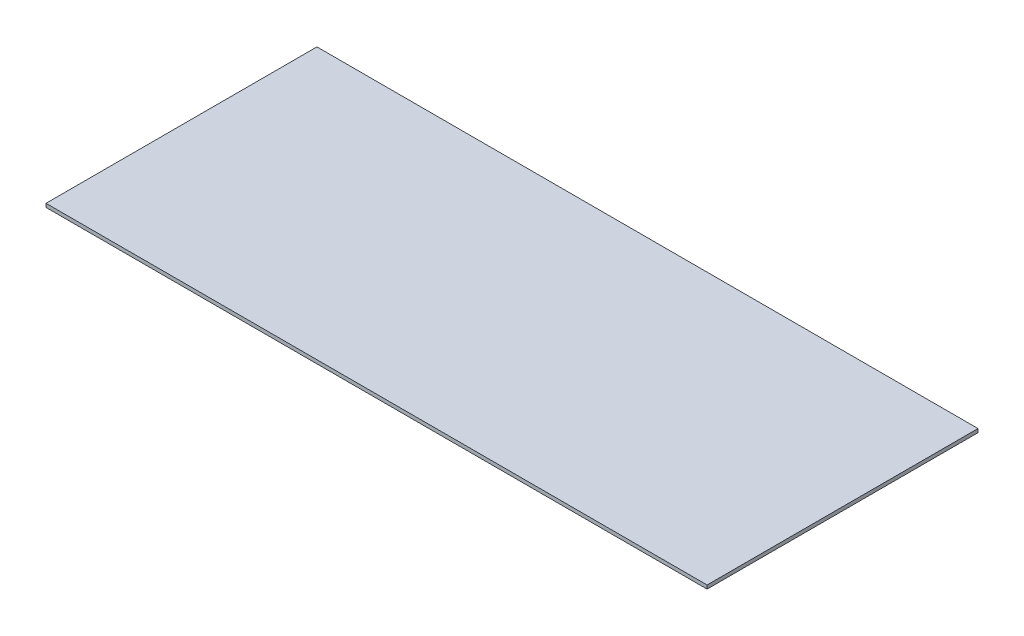
ISO-10303-21;
HEADER;
FILE_DESCRIPTION(('STEP AP214'),'2;1');
FILE_NAME('part.step','',(''),(''),'','','');
FILE_SCHEMA(('AUTOMOTIVE_DESIGN { 1 0 10303 214 1 1 1 1 }'));
ENDSEC;
DATA;
#1=APPLICATION_CONTEXT('core data for automotive mechanical design processes');
#2=APPLICATION_PROTOCOL_DEFINITION('international standard','automotive_design',2000,#1);
#3=PRODUCT_CONTEXT('',#1,'mechanical');
#4=PRODUCT('Part','Part','',(#3));
#5=PRODUCT_RELATED_PRODUCT_CATEGORY('part','',(#4));
#6=PRODUCT_DEFINITION_FORMATION('','',#4);
#7=PRODUCT_DEFINITION_CONTEXT('part definition',#1,'design');
#8=PRODUCT_DEFINITION('design','',#6,#7);
#9=PRODUCT_DEFINITION_SHAPE('','',#8);
#10=(LENGTH_UNIT() NAMED_UNIT(*) SI_UNIT(.MILLI.,.METRE.));
#11=(NAMED_UNIT(*) PLANE_ANGLE_UNIT() SI_UNIT($,.RADIAN.));
#12=(NAMED_UNIT(*) SI_UNIT($,.STERADIAN.) SOLID_ANGLE_UNIT());
#13=UNCERTAINTY_MEASURE_WITH_UNIT(LENGTH_MEASURE(1.E-05),#10,'distance_accuracy_value','');
#14=(GEOMETRIC_REPRESENTATION_CONTEXT(3) GLOBAL_UNCERTAINTY_ASSIGNED_CONTEXT((#13)) GLOBAL_UNIT_ASSIGNED_CONTEXT((#10,
#11,#12)) REPRESENTATION_CONTEXT('',''));
#15=CARTESIAN_POINT('',(0.,0.,0.));
#16=DIRECTION('',(0.,0.,1.));
#17=DIRECTION('',(1.,0.,0.));
#18=AXIS2_PLACEMENT_3D('',#15,#16,#17);
#19=CARTESIAN_POINT('',(-183.,2.,-75.));
#20=DIRECTION('',(1.,0.,0.));
#21=DIRECTION('',(0.,0.,-1.));
#22=AXIS2_PLACEMENT_3D('',#19,#20,#21);
#23=PLANE('',#22);
#24=DIRECTION('',(0.,0.,1.));
#25=VECTOR('',#24,1.);
#26=CARTESIAN_POINT('',(-183.,0.,-75.));
#27=LINE('',#26,#25);
#28=CARTESIAN_POINT('',(-183.,0.,-75.));
#29=VERTEX_POINT('',#28);
#30=CARTESIAN_POINT('',(-183.,0.,75.));
#31=VERTEX_POINT('',#30);
#32=EDGE_CURVE('E96',#29,#31,#27,.T.);
#33=ORIENTED_EDGE('',*,*,#32,.T.);
#34=DIRECTION('',(0.,-1.,0.));
#35=VECTOR('',#34,1.);
#36=CARTESIAN_POINT('',(-183.,2.,75.));
#37=LINE('',#36,#35);
#38=CARTESIAN_POINT('',(-183.,2.,75.));
#39=VERTEX_POINT('',#38);
#40=EDGE_CURVE('E11',#39,#31,#37,.T.);
#41=ORIENTED_EDGE('',*,*,#40,.F.);
#42=DIRECTION('',(0.,0.,1.));
#43=VECTOR('',#42,1.);
#44=CARTESIAN_POINT('',(-183.,2.,-75.));
#45=LINE('',#44,#43);
#46=CARTESIAN_POINT('',(-183.,2.,-75.));
#47=VERTEX_POINT('',#46);
#48=EDGE_CURVE('E84',#47,#39,#45,.T.);
#49=ORIENTED_EDGE('',*,*,#48,.F.);
#50=DIRECTION('',(0.,-1.,0.));
#51=VECTOR('',#50,1.);
#52=CARTESIAN_POINT('',(-183.,2.,-75.));
#53=LINE('',#52,#51);
#54=EDGE_CURVE('E92',#47,#29,#53,.T.);
#55=ORIENTED_EDGE('',*,*,#54,.T.);
#56=EDGE_LOOP('',(#33,#41,#49,#55));
#57=FACE_BOUND('',#56,.T.);
#58=ADVANCED_FACE('F33',(#57),#23,.F.);
#59=CARTESIAN_POINT('',(183.,2.,75.));
#60=DIRECTION('',(0.,0.,-1.));
#61=DIRECTION('',(-1.,0.,0.));
#62=AXIS2_PLACEMENT_3D('',#59,#60,#61);
#63=PLANE('',#62);
#64=DIRECTION('',(1.,0.,0.));
#65=VECTOR('',#64,1.);
#66=CARTESIAN_POINT('',(183.,0.,75.));
#67=LINE('',#66,#65);
#68=CARTESIAN_POINT('',(183.,0.,75.));
#69=VERTEX_POINT('',#68);
#70=EDGE_CURVE('E88',#31,#69,#67,.T.);
#71=ORIENTED_EDGE('',*,*,#70,.T.);
#72=DIRECTION('',(0.,-1.,0.));
#73=VECTOR('',#72,1.);
#74=CARTESIAN_POINT('',(183.,2.,75.));
#75=LINE('',#74,#73);
#76=CARTESIAN_POINT('',(183.,2.,75.));
#77=VERTEX_POINT('',#76);
#78=EDGE_CURVE('E41',#77,#69,#75,.T.);
#79=ORIENTED_EDGE('',*,*,#78,.F.);
#80=DIRECTION('',(1.,0.,0.));
#81=VECTOR('',#80,1.);
#82=CARTESIAN_POINT('',(183.,2.,75.));
#83=LINE('',#82,#81);
#84=EDGE_CURVE('E79',#39,#77,#83,.T.);
#85=ORIENTED_EDGE('',*,*,#84,.F.);
#86=ORIENTED_EDGE('',*,*,#40,.T.);
#87=EDGE_LOOP('',(#71,#79,#85,#86));
#88=FACE_BOUND('',#87,.T.);
#89=ADVANCED_FACE('F87',(#88),#63,.F.);
#90=CARTESIAN_POINT('',(183.,2.,-75.0000000000001));
#91=DIRECTION('',(-1.,0.,0.));
#92=DIRECTION('',(0.,0.,1.));
#93=AXIS2_PLACEMENT_3D('',#90,#91,#92);
#94=PLANE('',#93);
#95=DIRECTION('',(0.,0.,-1.));
#96=VECTOR('',#95,1.);
#97=CARTESIAN_POINT('',(183.,0.,-75.0000000000001));
#98=LINE('',#97,#96);
#99=CARTESIAN_POINT('',(183.,0.,-75.0000000000001));
#100=VERTEX_POINT('',#99);
#101=EDGE_CURVE('E66',#69,#100,#98,.T.);
#102=ORIENTED_EDGE('',*,*,#101,.T.);
#103=DIRECTION('',(0.,-1.,0.));
#104=VECTOR('',#103,1.);
#105=CARTESIAN_POINT('',(183.,2.,-75.0000000000001));
#106=LINE('',#105,#104);
#107=CARTESIAN_POINT('',(183.,2.,-75.0000000000001));
#108=VERTEX_POINT('',#107);
#109=EDGE_CURVE('E89',#108,#100,#106,.T.);
#110=ORIENTED_EDGE('',*,*,#109,.F.);
#111=DIRECTION('',(0.,0.,-1.));
#112=VECTOR('',#111,1.);
#113=CARTESIAN_POINT('',(183.,2.,-75.0000000000001));
#114=LINE('',#113,#112);
#115=EDGE_CURVE('E82',#77,#108,#114,.T.);
#116=ORIENTED_EDGE('',*,*,#115,.F.);
#117=ORIENTED_EDGE('',*,*,#78,.T.);
#118=EDGE_LOOP('',(#102,#110,#116,#117));
#119=FACE_BOUND('',#118,.T.);
#120=ADVANCED_FACE('F90',(#119),#94,.F.);
#121=CARTESIAN_POINT('',(183.,2.,-75.0000000000001));
#122=DIRECTION('',(0.,0.,1.));
#123=DIRECTION('',(1.,0.,0.));
#124=AXIS2_PLACEMENT_3D('',#121,#122,#123);
#125=PLANE('',#124);
#126=DIRECTION('',(-1.,0.,0.));
#127=VECTOR('',#126,1.);
#128=CARTESIAN_POINT('',(183.,0.,-75.0000000000001));
#129=LINE('',#128,#127);
#130=EDGE_CURVE('E72',#100,#29,#129,.T.);
#131=ORIENTED_EDGE('',*,*,#130,.T.);
#132=ORIENTED_EDGE('',*,*,#54,.F.);
#133=DIRECTION('',(-1.,0.,0.));
#134=VECTOR('',#133,1.);
#135=CARTESIAN_POINT('',(183.,2.,-75.0000000000001));
#136=LINE('',#135,#134);
#137=EDGE_CURVE('E49',#108,#47,#136,.T.);
#138=ORIENTED_EDGE('',*,*,#137,.F.);
#139=ORIENTED_EDGE('',*,*,#109,.T.);
#140=EDGE_LOOP('',(#131,#132,#138,#139));
#141=FACE_BOUND('',#140,.T.);
#142=ADVANCED_FACE('F103',(#141),#125,.F.);
#143=CARTESIAN_POINT('',(0.,2.,0.));
#144=DIRECTION('',(0.,-1.,0.));
#145=DIRECTION('',(0.,0.,-1.));
#146=AXIS2_PLACEMENT_3D('',#143,#144,#145);
#147=PLANE('',#146);
#148=ORIENTED_EDGE('',*,*,#48,.T.);
#149=ORIENTED_EDGE('',*,*,#84,.T.);
#150=ORIENTED_EDGE('',*,*,#115,.T.);
#151=ORIENTED_EDGE('',*,*,#137,.T.);
#152=EDGE_LOOP('',(#148,#149,#150,#151));
#153=FACE_BOUND('',#152,.T.);
#154=ADVANCED_FACE('F80',(#153),#147,.F.);
#155=CARTESIAN_POINT('',(0.,0.,0.));
#156=DIRECTION('',(0.,-1.,0.));
#157=DIRECTION('',(0.,0.,-1.));
#158=AXIS2_PLACEMENT_3D('',#155,#156,#157);
#159=PLANE('',#158);
#160=ORIENTED_EDGE('',*,*,#32,.F.);
#161=ORIENTED_EDGE('',*,*,#130,.F.);
#162=ORIENTED_EDGE('',*,*,#101,.F.);
#163=ORIENTED_EDGE('',*,*,#70,.F.);
#164=EDGE_LOOP('',(#160,#161,#162,#163));
#165=FACE_BOUND('',#164,.T.);
#166=ADVANCED_FACE('F106',(#165),#159,.T.);
#167=CLOSED_SHELL('',(#58,#89,#120,#142,#154,#166));
#168=MANIFOLD_SOLID_BREP('B2',#167);
#169=ADVANCED_BREP_SHAPE_REPRESENTATION('',(#18,#168),#14);
#170=SHAPE_DEFINITION_REPRESENTATION(#9,#169);
ENDSEC;
END-ISO-10303-21;
